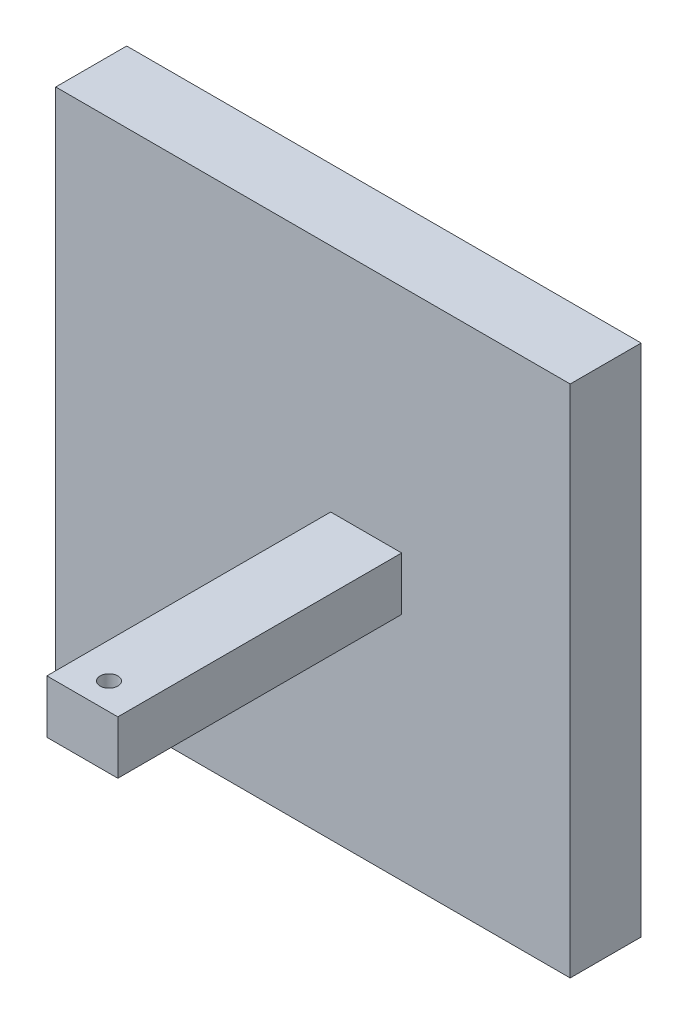
ISO-10303-21;
HEADER;
FILE_DESCRIPTION(('STEP AP214'),'2;1');
FILE_NAME('part.step','',(''),(''),'','','');
FILE_SCHEMA(('AUTOMOTIVE_DESIGN { 1 0 10303 214 1 1 1 1 }'));
ENDSEC;
DATA;
#1=APPLICATION_CONTEXT('core data for automotive mechanical design processes');
#2=APPLICATION_PROTOCOL_DEFINITION('international standard','automotive_design',2000,#1);
#3=PRODUCT_CONTEXT('',#1,'mechanical');
#4=PRODUCT('Part','Part','',(#3));
#5=PRODUCT_RELATED_PRODUCT_CATEGORY('part','',(#4));
#6=PRODUCT_DEFINITION_FORMATION('','',#4);
#7=PRODUCT_DEFINITION_CONTEXT('part definition',#1,'design');
#8=PRODUCT_DEFINITION('design','',#6,#7);
#9=PRODUCT_DEFINITION_SHAPE('','',#8);
#10=(LENGTH_UNIT() NAMED_UNIT(*) SI_UNIT(.MILLI.,.METRE.));
#11=(NAMED_UNIT(*) PLANE_ANGLE_UNIT() SI_UNIT($,.RADIAN.));
#12=(NAMED_UNIT(*) SI_UNIT($,.STERADIAN.) SOLID_ANGLE_UNIT());
#13=UNCERTAINTY_MEASURE_WITH_UNIT(LENGTH_MEASURE(1.E-05),#10,'distance_accuracy_value','');
#14=(GEOMETRIC_REPRESENTATION_CONTEXT(3) GLOBAL_UNCERTAINTY_ASSIGNED_CONTEXT((#13)) GLOBAL_UNIT_ASSIGNED_CONTEXT((#10,
#11,#12)) REPRESENTATION_CONTEXT('',''));
#15=CARTESIAN_POINT('',(0.,0.,0.));
#16=DIRECTION('',(0.,0.,1.));
#17=DIRECTION('',(1.,0.,0.));
#18=AXIS2_PLACEMENT_3D('',#15,#16,#17);
#19=CARTESIAN_POINT('',(0.,0.,101.6));
#20=DIRECTION('',(0.,0.,1.));
#21=DIRECTION('',(1.,0.,0.));
#22=AXIS2_PLACEMENT_3D('',#19,#20,#21);
#23=PLANE('',#22);
#24=DIRECTION('',(0.,1.,0.));
#25=VECTOR('',#24,1.);
#26=CARTESIAN_POINT('',(368.3,368.3,101.6));
#27=LINE('',#26,#25);
#28=CARTESIAN_POINT('',(368.3,-368.3,101.6));
#29=VERTEX_POINT('',#28);
#30=CARTESIAN_POINT('',(368.3,368.3,101.6));
#31=VERTEX_POINT('',#30);
#32=EDGE_CURVE('E144',#29,#31,#27,.T.);
#33=ORIENTED_EDGE('',*,*,#32,.T.);
#34=DIRECTION('',(-1.,0.,0.));
#35=VECTOR('',#34,1.);
#36=CARTESIAN_POINT('',(-368.3,368.3,101.6));
#37=LINE('',#36,#35);
#38=CARTESIAN_POINT('',(-368.3,368.3,101.6));
#39=VERTEX_POINT('',#38);
#40=EDGE_CURVE('E89',#31,#39,#37,.T.);
#41=ORIENTED_EDGE('',*,*,#40,.T.);
#42=DIRECTION('',(0.,-1.,0.));
#43=VECTOR('',#42,1.);
#44=CARTESIAN_POINT('',(-368.3,368.3,101.6));
#45=LINE('',#44,#43);
#46=CARTESIAN_POINT('',(-368.3,-368.3,101.6));
#47=VERTEX_POINT('',#46);
#48=EDGE_CURVE('E147',#39,#47,#45,.T.);
#49=ORIENTED_EDGE('',*,*,#48,.T.);
#50=DIRECTION('',(1.,0.,0.));
#51=VECTOR('',#50,1.);
#52=CARTESIAN_POINT('',(-368.3,-368.3,101.6));
#53=LINE('',#52,#51);
#54=EDGE_CURVE('E61',#47,#29,#53,.T.);
#55=ORIENTED_EDGE('',*,*,#54,.T.);
#56=EDGE_LOOP('',(#33,#41,#49,#55));
#57=FACE_BOUND('',#56,.T.);
#58=DIRECTION('',(-1.,0.,0.));
#59=VECTOR('',#58,1.);
#60=CARTESIAN_POINT('',(25.4,38.1,101.6));
#61=LINE('',#60,#59);
#62=CARTESIAN_POINT('',(127.,38.1,101.6));
#63=VERTEX_POINT('',#62);
#64=CARTESIAN_POINT('',(25.4,38.1,101.6));
#65=VERTEX_POINT('',#64);
#66=EDGE_CURVE('E216',#63,#65,#61,.T.);
#67=ORIENTED_EDGE('',*,*,#66,.F.);
#68=DIRECTION('',(0.,1.,0.));
#69=VECTOR('',#68,1.);
#70=CARTESIAN_POINT('',(127.,38.1,101.6));
#71=LINE('',#70,#69);
#72=CARTESIAN_POINT('',(127.,-38.1,101.6));
#73=VERTEX_POINT('',#72);
#74=EDGE_CURVE('E134',#73,#63,#71,.T.);
#75=ORIENTED_EDGE('',*,*,#74,.F.);
#76=DIRECTION('',(1.,0.,0.));
#77=VECTOR('',#76,1.);
#78=CARTESIAN_POINT('',(25.4,-38.1,101.6));
#79=LINE('',#78,#77);
#80=CARTESIAN_POINT('',(25.4,-38.1,101.6));
#81=VERTEX_POINT('',#80);
#82=EDGE_CURVE('E130',#81,#73,#79,.T.);
#83=ORIENTED_EDGE('',*,*,#82,.F.);
#84=DIRECTION('',(0.,-1.,0.));
#85=VECTOR('',#84,1.);
#86=CARTESIAN_POINT('',(25.4,38.1,101.6));
#87=LINE('',#86,#85);
#88=EDGE_CURVE('E224',#65,#81,#87,.T.);
#89=ORIENTED_EDGE('',*,*,#88,.F.);
#90=EDGE_LOOP('',(#67,#75,#83,#89));
#91=FACE_BOUND('',#90,.T.);
#92=ADVANCED_FACE('F37',(#57,#91),#23,.T.);
#93=CARTESIAN_POINT('',(368.3,368.3,101.6));
#94=DIRECTION('',(-1.,0.,0.));
#95=DIRECTION('',(0.,-1.,0.));
#96=AXIS2_PLACEMENT_3D('',#93,#94,#95);
#97=PLANE('',#96);
#98=DIRECTION('',(0.,1.,0.));
#99=VECTOR('',#98,1.);
#100=CARTESIAN_POINT('',(368.3,368.3,0.));
#101=LINE('',#100,#99);
#102=CARTESIAN_POINT('',(368.3,-368.3,0.));
#103=VERTEX_POINT('',#102);
#104=CARTESIAN_POINT('',(368.3,368.3,0.));
#105=VERTEX_POINT('',#104);
#106=EDGE_CURVE('E136',#103,#105,#101,.T.);
#107=ORIENTED_EDGE('',*,*,#106,.T.);
#108=DIRECTION('',(0.,0.,-1.));
#109=VECTOR('',#108,1.);
#110=CARTESIAN_POINT('',(368.3,368.3,101.6));
#111=LINE('',#110,#109);
#112=EDGE_CURVE('E11',#31,#105,#111,.T.);
#113=ORIENTED_EDGE('',*,*,#112,.F.);
#114=ORIENTED_EDGE('',*,*,#32,.F.);
#115=DIRECTION('',(0.,0.,-1.));
#116=VECTOR('',#115,1.);
#117=CARTESIAN_POINT('',(368.3,-368.3,101.6));
#118=LINE('',#117,#116);
#119=EDGE_CURVE('E149',#29,#103,#118,.T.);
#120=ORIENTED_EDGE('',*,*,#119,.T.);
#121=EDGE_LOOP('',(#107,#113,#114,#120));
#122=FACE_BOUND('',#121,.T.);
#123=ADVANCED_FACE('F39',(#122),#97,.F.);
#124=CARTESIAN_POINT('',(-368.3,368.3,101.6));
#125=DIRECTION('',(0.,-1.,0.));
#126=DIRECTION('',(0.,0.,-1.));
#127=AXIS2_PLACEMENT_3D('',#124,#125,#126);
#128=PLANE('',#127);
#129=DIRECTION('',(-1.,0.,0.));
#130=VECTOR('',#129,1.);
#131=CARTESIAN_POINT('',(-368.3,368.3,0.));
#132=LINE('',#131,#130);
#133=CARTESIAN_POINT('',(-368.3,368.3,0.));
#134=VERTEX_POINT('',#133);
#135=EDGE_CURVE('E139',#105,#134,#132,.T.);
#136=ORIENTED_EDGE('',*,*,#135,.T.);
#137=DIRECTION('',(0.,0.,-1.));
#138=VECTOR('',#137,1.);
#139=CARTESIAN_POINT('',(-368.3,368.3,101.6));
#140=LINE('',#139,#138);
#141=EDGE_CURVE('E45',#39,#134,#140,.T.);
#142=ORIENTED_EDGE('',*,*,#141,.F.);
#143=ORIENTED_EDGE('',*,*,#40,.F.);
#144=ORIENTED_EDGE('',*,*,#112,.T.);
#145=EDGE_LOOP('',(#136,#142,#143,#144));
#146=FACE_BOUND('',#145,.T.);
#147=ADVANCED_FACE('F177',(#146),#128,.F.);
#148=CARTESIAN_POINT('',(-368.3,368.3,101.6));
#149=DIRECTION('',(1.,0.,0.));
#150=DIRECTION('',(0.,1.,0.));
#151=AXIS2_PLACEMENT_3D('',#148,#149,#150);
#152=PLANE('',#151);
#153=DIRECTION('',(0.,-1.,0.));
#154=VECTOR('',#153,1.);
#155=CARTESIAN_POINT('',(-368.3,368.3,0.));
#156=LINE('',#155,#154);
#157=CARTESIAN_POINT('',(-368.3,-368.3,0.));
#158=VERTEX_POINT('',#157);
#159=EDGE_CURVE('E152',#134,#158,#156,.T.);
#160=ORIENTED_EDGE('',*,*,#159,.T.);
#161=DIRECTION('',(0.,0.,-1.));
#162=VECTOR('',#161,1.);
#163=CARTESIAN_POINT('',(-368.3,-368.3,101.6));
#164=LINE('',#163,#162);
#165=EDGE_CURVE('E156',#47,#158,#164,.T.);
#166=ORIENTED_EDGE('',*,*,#165,.F.);
#167=ORIENTED_EDGE('',*,*,#48,.F.);
#168=ORIENTED_EDGE('',*,*,#141,.T.);
#169=EDGE_LOOP('',(#160,#166,#167,#168));
#170=FACE_BOUND('',#169,.T.);
#171=ADVANCED_FACE('F161',(#170),#152,.F.);
#172=CARTESIAN_POINT('',(-368.3,-368.3,101.6));
#173=DIRECTION('',(0.,1.,0.));
#174=DIRECTION('',(0.,0.,1.));
#175=AXIS2_PLACEMENT_3D('',#172,#173,#174);
#176=PLANE('',#175);
#177=DIRECTION('',(1.,0.,0.));
#178=VECTOR('',#177,1.);
#179=CARTESIAN_POINT('',(-368.3,-368.3,0.));
#180=LINE('',#179,#178);
#181=EDGE_CURVE('E82',#158,#103,#180,.T.);
#182=ORIENTED_EDGE('',*,*,#181,.T.);
#183=ORIENTED_EDGE('',*,*,#119,.F.);
#184=ORIENTED_EDGE('',*,*,#54,.F.);
#185=ORIENTED_EDGE('',*,*,#165,.T.);
#186=EDGE_LOOP('',(#182,#183,#184,#185));
#187=FACE_BOUND('',#186,.T.);
#188=ADVANCED_FACE('F169',(#187),#176,.F.);
#189=CARTESIAN_POINT('',(0.,0.,0.));
#190=DIRECTION('',(0.,0.,1.));
#191=DIRECTION('',(1.,0.,0.));
#192=AXIS2_PLACEMENT_3D('',#189,#190,#191);
#193=PLANE('',#192);
#194=ORIENTED_EDGE('',*,*,#106,.F.);
#195=ORIENTED_EDGE('',*,*,#181,.F.);
#196=ORIENTED_EDGE('',*,*,#159,.F.);
#197=ORIENTED_EDGE('',*,*,#135,.F.);
#198=EDGE_LOOP('',(#194,#195,#196,#197));
#199=FACE_BOUND('',#198,.T.);
#200=ADVANCED_FACE('F165',(#199),#193,.F.);
#201=CARTESIAN_POINT('',(127.,38.1,508.));
#202=DIRECTION('',(-1.,0.,0.));
#203=DIRECTION('',(0.,0.,1.));
#204=AXIS2_PLACEMENT_3D('',#201,#202,#203);
#205=PLANE('',#204);
#206=ORIENTED_EDGE('',*,*,#74,.T.);
#207=DIRECTION('',(0.,0.,-1.));
#208=VECTOR('',#207,1.);
#209=CARTESIAN_POINT('',(127.,38.1,508.));
#210=LINE('',#209,#208);
#211=CARTESIAN_POINT('',(127.,38.1,508.));
#212=VERTEX_POINT('',#211);
#213=EDGE_CURVE('E115',#212,#63,#210,.T.);
#214=ORIENTED_EDGE('',*,*,#213,.F.);
#215=DIRECTION('',(0.,1.,0.));
#216=VECTOR('',#215,1.);
#217=CARTESIAN_POINT('',(127.,38.1,508.));
#218=LINE('',#217,#216);
#219=CARTESIAN_POINT('',(127.,-38.1,508.));
#220=VERTEX_POINT('',#219);
#221=EDGE_CURVE('E122',#220,#212,#218,.T.);
#222=ORIENTED_EDGE('',*,*,#221,.F.);
#223=DIRECTION('',(0.,0.,-1.));
#224=VECTOR('',#223,1.);
#225=CARTESIAN_POINT('',(127.,-38.1,508.));
#226=LINE('',#225,#224);
#227=EDGE_CURVE('E221',#220,#73,#226,.T.);
#228=ORIENTED_EDGE('',*,*,#227,.T.);
#229=EDGE_LOOP('',(#206,#214,#222,#228));
#230=FACE_BOUND('',#229,.T.);
#231=ADVANCED_FACE('F132',(#230),#205,.F.);
#232=CARTESIAN_POINT('',(25.4,38.1,508.));
#233=DIRECTION('',(0.,-1.,0.));
#234=DIRECTION('',(0.,0.,-1.));
#235=AXIS2_PLACEMENT_3D('',#232,#233,#234);
#236=PLANE('',#235);
#237=CARTESIAN_POINT('',(76.2,38.1,469.9));
#238=DIRECTION('',(0.,-1.,0.));
#239=DIRECTION('',(0.,0.,-1.));
#240=AXIS2_PLACEMENT_3D('',#237,#238,#239);
#241=CIRCLE('',#240,12.7);
#242=CARTESIAN_POINT('',(76.2,38.1,457.2));
#243=VERTEX_POINT('',#242);
#244=EDGE_CURVE('E214',#243,#243,#241,.T.);
#245=ORIENTED_EDGE('',*,*,#244,.T.);
#246=EDGE_LOOP('',(#245));
#247=FACE_BOUND('',#246,.T.);
#248=ORIENTED_EDGE('',*,*,#66,.T.);
#249=DIRECTION('',(0.,0.,-1.));
#250=VECTOR('',#249,1.);
#251=CARTESIAN_POINT('',(25.4,38.1,508.));
#252=LINE('',#251,#250);
#253=CARTESIAN_POINT('',(25.4,38.1,508.));
#254=VERTEX_POINT('',#253);
#255=EDGE_CURVE('E118',#254,#65,#252,.T.);
#256=ORIENTED_EDGE('',*,*,#255,.F.);
#257=DIRECTION('',(-1.,0.,0.));
#258=VECTOR('',#257,1.);
#259=CARTESIAN_POINT('',(25.4,38.1,508.));
#260=LINE('',#259,#258);
#261=EDGE_CURVE('E111',#212,#254,#260,.T.);
#262=ORIENTED_EDGE('',*,*,#261,.F.);
#263=ORIENTED_EDGE('',*,*,#213,.T.);
#264=EDGE_LOOP('',(#248,#256,#262,#263));
#265=FACE_BOUND('',#264,.T.);
#266=ADVANCED_FACE('F113',(#247,#265),#236,.F.);
#267=CARTESIAN_POINT('',(25.4,38.1,508.));
#268=DIRECTION('',(1.,0.,0.));
#269=DIRECTION('',(0.,1.,0.));
#270=AXIS2_PLACEMENT_3D('',#267,#268,#269);
#271=PLANE('',#270);
#272=ORIENTED_EDGE('',*,*,#88,.T.);
#273=DIRECTION('',(0.,0.,-1.));
#274=VECTOR('',#273,1.);
#275=CARTESIAN_POINT('',(25.4,-38.1,508.));
#276=LINE('',#275,#274);
#277=CARTESIAN_POINT('',(25.4,-38.1,508.));
#278=VERTEX_POINT('',#277);
#279=EDGE_CURVE('E52',#278,#81,#276,.T.);
#280=ORIENTED_EDGE('',*,*,#279,.F.);
#281=DIRECTION('',(0.,-1.,0.));
#282=VECTOR('',#281,1.);
#283=CARTESIAN_POINT('',(25.4,38.1,508.));
#284=LINE('',#283,#282);
#285=EDGE_CURVE('E121',#254,#278,#284,.T.);
#286=ORIENTED_EDGE('',*,*,#285,.F.);
#287=ORIENTED_EDGE('',*,*,#255,.T.);
#288=EDGE_LOOP('',(#272,#280,#286,#287));
#289=FACE_BOUND('',#288,.T.);
#290=ADVANCED_FACE('F192',(#289),#271,.F.);
#291=CARTESIAN_POINT('',(25.4,-38.1,508.));
#292=DIRECTION('',(0.,1.,0.));
#293=DIRECTION('',(0.,0.,1.));
#294=AXIS2_PLACEMENT_3D('',#291,#292,#293);
#295=PLANE('',#294);
#296=CARTESIAN_POINT('',(76.2,-38.1,469.9));
#297=DIRECTION('',(0.,-1.,0.));
#298=DIRECTION('',(0.,0.,-1.));
#299=AXIS2_PLACEMENT_3D('',#296,#297,#298);
#300=CIRCLE('',#299,12.7);
#301=CARTESIAN_POINT('',(76.2,-38.1,457.2));
#302=VERTEX_POINT('',#301);
#303=EDGE_CURVE('E211',#302,#302,#300,.T.);
#304=ORIENTED_EDGE('',*,*,#303,.F.);
#305=EDGE_LOOP('',(#304));
#306=FACE_BOUND('',#305,.T.);
#307=ORIENTED_EDGE('',*,*,#82,.T.);
#308=ORIENTED_EDGE('',*,*,#227,.F.);
#309=DIRECTION('',(1.,0.,0.));
#310=VECTOR('',#309,1.);
#311=CARTESIAN_POINT('',(25.4,-38.1,508.));
#312=LINE('',#311,#310);
#313=EDGE_CURVE('E126',#278,#220,#312,.T.);
#314=ORIENTED_EDGE('',*,*,#313,.F.);
#315=ORIENTED_EDGE('',*,*,#279,.T.);
#316=EDGE_LOOP('',(#307,#308,#314,#315));
#317=FACE_BOUND('',#316,.T.);
#318=ADVANCED_FACE('F196',(#306,#317),#295,.F.);
#319=CARTESIAN_POINT('',(0.,0.,508.));
#320=DIRECTION('',(0.,0.,1.));
#321=DIRECTION('',(1.,0.,0.));
#322=AXIS2_PLACEMENT_3D('',#319,#320,#321);
#323=PLANE('',#322);
#324=ORIENTED_EDGE('',*,*,#221,.T.);
#325=ORIENTED_EDGE('',*,*,#261,.T.);
#326=ORIENTED_EDGE('',*,*,#285,.T.);
#327=ORIENTED_EDGE('',*,*,#313,.T.);
#328=EDGE_LOOP('',(#324,#325,#326,#327));
#329=FACE_BOUND('',#328,.T.);
#330=ADVANCED_FACE('F125',(#329),#323,.T.);
#331=CARTESIAN_POINT('',(76.2,469.9,469.9));
#332=DIRECTION('',(0.,-1.,0.));
#333=DIRECTION('',(0.,0.,-1.));
#334=AXIS2_PLACEMENT_3D('',#331,#332,#333);
#335=CYLINDRICAL_SURFACE('',#334,12.7);
#336=ORIENTED_EDGE('',*,*,#303,.T.);
#337=EDGE_LOOP('',(#336));
#338=FACE_BOUND('',#337,.T.);
#339=ORIENTED_EDGE('',*,*,#244,.F.);
#340=EDGE_LOOP('',(#339));
#341=FACE_BOUND('',#340,.T.);
#342=ADVANCED_FACE('F203',(#338,#341),#335,.F.);
#343=CLOSED_SHELL('',(#92,#123,#147,#171,#188,#200,#231,#266,#290,#318,#330,#342));
#344=MANIFOLD_SOLID_BREP('B2',#343);
#345=ADVANCED_BREP_SHAPE_REPRESENTATION('',(#18,#344),#14);
#346=SHAPE_DEFINITION_REPRESENTATION(#9,#345);
ENDSEC;
END-ISO-10303-21;
